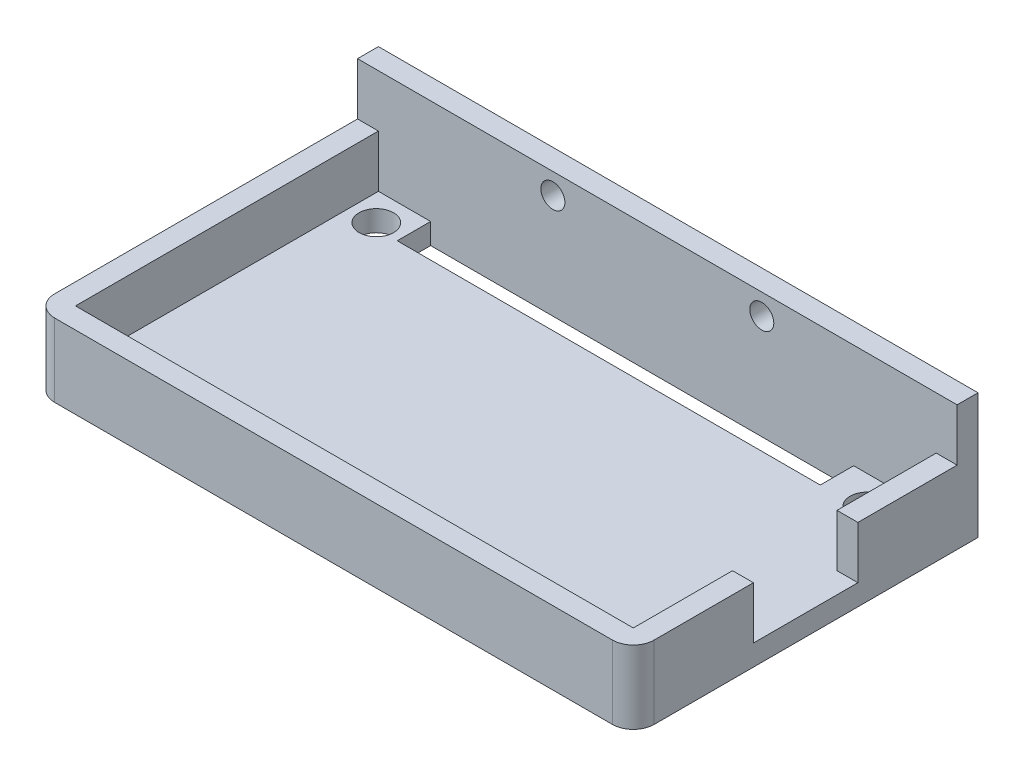
ISO-10303-21;
HEADER;
FILE_DESCRIPTION(('STEP AP214'),'2;1');
FILE_NAME('part.step','',(''),(''),'','','');
FILE_SCHEMA(('AUTOMOTIVE_DESIGN { 1 0 10303 214 1 1 1 1 }'));
ENDSEC;
DATA;
#1=APPLICATION_CONTEXT('core data for automotive mechanical design processes');
#2=APPLICATION_PROTOCOL_DEFINITION('international standard','automotive_design',2000,#1);
#3=PRODUCT_CONTEXT('',#1,'mechanical');
#4=PRODUCT('Part','Part','',(#3));
#5=PRODUCT_RELATED_PRODUCT_CATEGORY('part','',(#4));
#6=PRODUCT_DEFINITION_FORMATION('','',#4);
#7=PRODUCT_DEFINITION_CONTEXT('part definition',#1,'design');
#8=PRODUCT_DEFINITION('design','',#6,#7);
#9=PRODUCT_DEFINITION_SHAPE('','',#8);
#10=(LENGTH_UNIT() NAMED_UNIT(*) SI_UNIT(.MILLI.,.METRE.));
#11=(NAMED_UNIT(*) PLANE_ANGLE_UNIT() SI_UNIT($,.RADIAN.));
#12=(NAMED_UNIT(*) SI_UNIT($,.STERADIAN.) SOLID_ANGLE_UNIT());
#13=UNCERTAINTY_MEASURE_WITH_UNIT(LENGTH_MEASURE(1.E-05),#10,'distance_accuracy_value','');
#14=(GEOMETRIC_REPRESENTATION_CONTEXT(3) GLOBAL_UNCERTAINTY_ASSIGNED_CONTEXT((#13)) GLOBAL_UNIT_ASSIGNED_CONTEXT((#10,
#11,#12)) REPRESENTATION_CONTEXT('',''));
#15=CARTESIAN_POINT('',(0.,0.,0.));
#16=DIRECTION('',(0.,0.,1.));
#17=DIRECTION('',(1.,0.,0.));
#18=AXIS2_PLACEMENT_3D('',#15,#16,#17);
#19=CARTESIAN_POINT('',(0.,7.,0.));
#20=DIRECTION('',(0.,-1.,0.));
#21=DIRECTION('',(0.,0.,-1.));
#22=AXIS2_PLACEMENT_3D('',#19,#20,#21);
#23=PLANE('',#22);
#24=DIRECTION('',(0.,0.,1.));
#25=VECTOR('',#24,1.);
#26=CARTESIAN_POINT('',(0.,7.,0.));
#27=LINE('',#26,#25);
#28=CARTESIAN_POINT('',(0.,7.,-31.));
#29=VERTEX_POINT('',#28);
#30=CARTESIAN_POINT('',(0.,7.,-2.));
#31=VERTEX_POINT('',#30);
#32=EDGE_CURVE('E226',#29,#31,#27,.T.);
#33=ORIENTED_EDGE('',*,*,#32,.T.);
#34=CARTESIAN_POINT('',(2.,7.,-2.));
#35=DIRECTION('',(0.,-1.,0.));
#36=DIRECTION('',(0.,0.,-1.));
#37=AXIS2_PLACEMENT_3D('',#34,#35,#36);
#38=CIRCLE('',#37,2.);
#39=CARTESIAN_POINT('',(2.,7.,0.));
#40=VERTEX_POINT('',#39);
#41=EDGE_CURVE('E45',#31,#40,#38,.F.);
#42=ORIENTED_EDGE('',*,*,#41,.T.);
#43=DIRECTION('',(1.,0.,0.));
#44=VECTOR('',#43,1.);
#45=CARTESIAN_POINT('',(0.,7.,0.));
#46=LINE('',#45,#44);
#47=CARTESIAN_POINT('',(55.4,7.,0.));
#48=VERTEX_POINT('',#47);
#49=EDGE_CURVE('E373',#40,#48,#46,.T.);
#50=ORIENTED_EDGE('',*,*,#49,.T.);
#51=CARTESIAN_POINT('',(55.4,7.,-2.));
#52=DIRECTION('',(0.,-1.,0.));
#53=DIRECTION('',(0.,0.,-1.));
#54=AXIS2_PLACEMENT_3D('',#51,#52,#53);
#55=CIRCLE('',#54,2.);
#56=CARTESIAN_POINT('',(57.4,7.,-2.));
#57=VERTEX_POINT('',#56);
#58=EDGE_CURVE('E52',#48,#57,#55,.F.);
#59=ORIENTED_EDGE('',*,*,#58,.T.);
#60=DIRECTION('',(0.,0.,-1.));
#61=VECTOR('',#60,1.);
#62=CARTESIAN_POINT('',(57.4,7.,0.));
#63=LINE('',#62,#61);
#64=CARTESIAN_POINT('',(57.4,7.,-11.5));
#65=VERTEX_POINT('',#64);
#66=EDGE_CURVE('E377',#57,#65,#63,.T.);
#67=ORIENTED_EDGE('',*,*,#66,.T.);
#68=DIRECTION('',(1.,0.,0.));
#69=VECTOR('',#68,1.);
#70=CARTESIAN_POINT('',(55.4,7.,-11.5));
#71=LINE('',#70,#69);
#72=CARTESIAN_POINT('',(55.4,7.,-11.5));
#73=VERTEX_POINT('',#72);
#74=EDGE_CURVE('E227',#73,#65,#71,.T.);
#75=ORIENTED_EDGE('',*,*,#74,.F.);
#76=DIRECTION('',(0.,0.,-1.));
#77=VECTOR('',#76,1.);
#78=CARTESIAN_POINT('',(55.4,7.,0.));
#79=LINE('',#78,#77);
#80=CARTESIAN_POINT('',(55.4,7.,-2.));
#81=VERTEX_POINT('',#80);
#82=EDGE_CURVE('E349',#81,#73,#79,.T.);
#83=ORIENTED_EDGE('',*,*,#82,.F.);
#84=DIRECTION('',(1.,0.,0.));
#85=VECTOR('',#84,1.);
#86=CARTESIAN_POINT('',(0.,7.,-2.));
#87=LINE('',#86,#85);
#88=CARTESIAN_POINT('',(2.,7.,-2.));
#89=VERTEX_POINT('',#88);
#90=EDGE_CURVE('E367',#89,#81,#87,.T.);
#91=ORIENTED_EDGE('',*,*,#90,.F.);
#92=DIRECTION('',(0.,0.,1.));
#93=VECTOR('',#92,1.);
#94=CARTESIAN_POINT('',(2.,7.,0.));
#95=LINE('',#94,#93);
#96=CARTESIAN_POINT('',(2.,7.,-31.));
#97=VERTEX_POINT('',#96);
#98=EDGE_CURVE('E365',#97,#89,#95,.T.);
#99=ORIENTED_EDGE('',*,*,#98,.F.);
#100=DIRECTION('',(1.,0.,0.));
#101=VECTOR('',#100,1.);
#102=CARTESIAN_POINT('',(0.,7.,-31.));
#103=LINE('',#102,#101);
#104=EDGE_CURVE('E223',#29,#97,#103,.T.);
#105=ORIENTED_EDGE('',*,*,#104,.F.);
#106=EDGE_LOOP('',(#33,#42,#50,#59,#67,#75,#83,#91,#99,#105));
#107=FACE_BOUND('',#106,.T.);
#108=ADVANCED_FACE('F37',(#107),#23,.F.);
#109=CARTESIAN_POINT('',(55.4,7.,-31.));
#110=VERTEX_POINT('',#109);
#111=CARTESIAN_POINT('',(57.4,7.,-31.));
#112=VERTEX_POINT('',#111);
#113=EDGE_CURVE('E391',#110,#112,#103,.T.);
#114=ORIENTED_EDGE('',*,*,#113,.F.);
#115=CARTESIAN_POINT('',(55.4,7.,-21.5));
#116=VERTEX_POINT('',#115);
#117=EDGE_CURVE('E369',#116,#110,#79,.T.);
#118=ORIENTED_EDGE('',*,*,#117,.F.);
#119=DIRECTION('',(-1.,0.,0.));
#120=VECTOR('',#119,1.);
#121=CARTESIAN_POINT('',(55.4,7.,-21.5));
#122=LINE('',#121,#120);
#123=CARTESIAN_POINT('',(57.4,7.,-21.5));
#124=VERTEX_POINT('',#123);
#125=EDGE_CURVE('E230',#124,#116,#122,.T.);
#126=ORIENTED_EDGE('',*,*,#125,.F.);
#127=EDGE_CURVE('E376',#124,#112,#63,.T.);
#128=ORIENTED_EDGE('',*,*,#127,.T.);
#129=EDGE_LOOP('',(#114,#118,#126,#128));
#130=FACE_BOUND('',#129,.T.);
#131=ADVANCED_FACE('F428',(#130),#23,.F.);
#132=CARTESIAN_POINT('',(55.4,7.,0.));
#133=DIRECTION('',(-1.,0.,0.));
#134=DIRECTION('',(0.,0.,1.));
#135=AXIS2_PLACEMENT_3D('',#132,#133,#134);
#136=PLANE('',#135);
#137=DIRECTION('',(0.,1.,0.));
#138=VECTOR('',#137,1.);
#139=CARTESIAN_POINT('',(55.4,-8.19803902718557,-11.5));
#140=LINE('',#139,#138);
#141=CARTESIAN_POINT('',(55.4,2.,-11.5));
#142=VERTEX_POINT('',#141);
#143=EDGE_CURVE('E249',#142,#73,#140,.T.);
#144=ORIENTED_EDGE('',*,*,#143,.F.);
#145=DIRECTION('',(0.,0.,-1.));
#146=VECTOR('',#145,1.);
#147=CARTESIAN_POINT('',(55.4,2.,0.));
#148=LINE('',#147,#146);
#149=CARTESIAN_POINT('',(55.4,2.,-2.));
#150=VERTEX_POINT('',#149);
#151=EDGE_CURVE('E356',#150,#142,#148,.T.);
#152=ORIENTED_EDGE('',*,*,#151,.F.);
#153=DIRECTION('',(0.,-1.,0.));
#154=VECTOR('',#153,1.);
#155=CARTESIAN_POINT('',(55.4,7.,-2.));
#156=LINE('',#155,#154);
#157=EDGE_CURVE('E344',#81,#150,#156,.T.);
#158=ORIENTED_EDGE('',*,*,#157,.F.);
#159=ORIENTED_EDGE('',*,*,#82,.T.);
#160=EDGE_LOOP('',(#144,#152,#158,#159));
#161=FACE_BOUND('',#160,.T.);
#162=ADVANCED_FACE('F435',(#161),#136,.T.);
#163=CARTESIAN_POINT('',(0.,7.,0.));
#164=DIRECTION('',(1.,0.,0.));
#165=DIRECTION('',(0.,0.,-1.));
#166=AXIS2_PLACEMENT_3D('',#163,#164,#165);
#167=PLANE('',#166);
#168=DIRECTION('',(0.,0.,1.));
#169=VECTOR('',#168,1.);
#170=CARTESIAN_POINT('',(0.,0.,0.));
#171=LINE('',#170,#169);
#172=CARTESIAN_POINT('',(0.,0.,-33.));
#173=VERTEX_POINT('',#172);
#174=CARTESIAN_POINT('',(0.,0.,-2.));
#175=VERTEX_POINT('',#174);
#176=EDGE_CURVE('E343',#173,#175,#171,.T.);
#177=ORIENTED_EDGE('',*,*,#176,.T.);
#178=DIRECTION('',(0.,-1.,0.));
#179=VECTOR('',#178,1.);
#180=CARTESIAN_POINT('',(0.,7.,-2.));
#181=LINE('',#180,#179);
#182=EDGE_CURVE('E60',#175,#31,#181,.F.);
#183=ORIENTED_EDGE('',*,*,#182,.T.);
#184=ORIENTED_EDGE('',*,*,#32,.F.);
#185=DIRECTION('',(0.,-1.,0.));
#186=VECTOR('',#185,1.);
#187=CARTESIAN_POINT('',(0.,12.,-31.));
#188=LINE('',#187,#186);
#189=CARTESIAN_POINT('',(0.,12.,-31.));
#190=VERTEX_POINT('',#189);
#191=EDGE_CURVE('E207',#190,#29,#188,.T.);
#192=ORIENTED_EDGE('',*,*,#191,.F.);
#193=DIRECTION('',(0.,0.,1.));
#194=VECTOR('',#193,1.);
#195=CARTESIAN_POINT('',(0.,12.,-33.));
#196=LINE('',#195,#194);
#197=CARTESIAN_POINT('',(0.,12.,-33.));
#198=VERTEX_POINT('',#197);
#199=EDGE_CURVE('E215',#198,#190,#196,.T.);
#200=ORIENTED_EDGE('',*,*,#199,.F.);
#201=DIRECTION('',(0.,-1.,0.));
#202=VECTOR('',#201,1.);
#203=CARTESIAN_POINT('',(0.,7.,-33.));
#204=LINE('',#203,#202);
#205=EDGE_CURVE('E379',#198,#173,#204,.T.);
#206=ORIENTED_EDGE('',*,*,#205,.T.);
#207=EDGE_LOOP('',(#177,#183,#184,#192,#200,#206));
#208=FACE_BOUND('',#207,.T.);
#209=ADVANCED_FACE('F225',(#208),#167,.F.);
#210=CARTESIAN_POINT('',(0.,7.,0.));
#211=DIRECTION('',(0.,0.,-1.));
#212=DIRECTION('',(-1.,0.,0.));
#213=AXIS2_PLACEMENT_3D('',#210,#211,#212);
#214=PLANE('',#213);
#215=ORIENTED_EDGE('',*,*,#49,.F.);
#216=DIRECTION('',(0.,-1.,0.));
#217=VECTOR('',#216,1.);
#218=CARTESIAN_POINT('',(2.,7.,0.));
#219=LINE('',#218,#217);
#220=CARTESIAN_POINT('',(2.,0.,0.));
#221=VERTEX_POINT('',#220);
#222=EDGE_CURVE('E394',#40,#221,#219,.T.);
#223=ORIENTED_EDGE('',*,*,#222,.T.);
#224=DIRECTION('',(1.,0.,0.));
#225=VECTOR('',#224,1.);
#226=CARTESIAN_POINT('',(0.,0.,0.));
#227=LINE('',#226,#225);
#228=CARTESIAN_POINT('',(55.4,0.,0.));
#229=VERTEX_POINT('',#228);
#230=EDGE_CURVE('E381',#221,#229,#227,.T.);
#231=ORIENTED_EDGE('',*,*,#230,.T.);
#232=DIRECTION('',(0.,-1.,0.));
#233=VECTOR('',#232,1.);
#234=CARTESIAN_POINT('',(55.4,7.,0.));
#235=LINE('',#234,#233);
#236=EDGE_CURVE('E392',#229,#48,#235,.F.);
#237=ORIENTED_EDGE('',*,*,#236,.T.);
#238=EDGE_LOOP('',(#215,#223,#231,#237));
#239=FACE_BOUND('',#238,.T.);
#240=ADVANCED_FACE('F407',(#239),#214,.F.);
#241=CARTESIAN_POINT('',(57.4,7.,0.));
#242=DIRECTION('',(-1.,0.,0.));
#243=DIRECTION('',(0.,0.,1.));
#244=AXIS2_PLACEMENT_3D('',#241,#242,#243);
#245=PLANE('',#244);
#246=ORIENTED_EDGE('',*,*,#66,.F.);
#247=DIRECTION('',(0.,-1.,0.));
#248=VECTOR('',#247,1.);
#249=CARTESIAN_POINT('',(57.4,7.,-2.));
#250=LINE('',#249,#248);
#251=CARTESIAN_POINT('',(57.4,0.,-2.));
#252=VERTEX_POINT('',#251);
#253=EDGE_CURVE('E11',#57,#252,#250,.T.);
#254=ORIENTED_EDGE('',*,*,#253,.T.);
#255=DIRECTION('',(0.,0.,-1.));
#256=VECTOR('',#255,1.);
#257=CARTESIAN_POINT('',(57.4,0.,0.));
#258=LINE('',#257,#256);
#259=CARTESIAN_POINT('',(57.4,0.,-33.));
#260=VERTEX_POINT('',#259);
#261=EDGE_CURVE('E384',#252,#260,#258,.T.);
#262=ORIENTED_EDGE('',*,*,#261,.T.);
#263=DIRECTION('',(0.,-1.,0.));
#264=VECTOR('',#263,1.);
#265=CARTESIAN_POINT('',(57.4,7.,-33.));
#266=LINE('',#265,#264);
#267=CARTESIAN_POINT('',(57.4,12.,-33.));
#268=VERTEX_POINT('',#267);
#269=EDGE_CURVE('E388',#268,#260,#266,.T.);
#270=ORIENTED_EDGE('',*,*,#269,.F.);
#271=DIRECTION('',(0.,0.,-1.));
#272=VECTOR('',#271,1.);
#273=CARTESIAN_POINT('',(57.4,12.,-33.));
#274=LINE('',#273,#272);
#275=CARTESIAN_POINT('',(57.4,12.,-31.));
#276=VERTEX_POINT('',#275);
#277=EDGE_CURVE('E214',#276,#268,#274,.T.);
#278=ORIENTED_EDGE('',*,*,#277,.F.);
#279=DIRECTION('',(0.,-1.,0.));
#280=VECTOR('',#279,1.);
#281=CARTESIAN_POINT('',(57.4,12.,-31.));
#282=LINE('',#281,#280);
#283=EDGE_CURVE('E210',#276,#112,#282,.T.);
#284=ORIENTED_EDGE('',*,*,#283,.T.);
#285=ORIENTED_EDGE('',*,*,#127,.F.);
#286=DIRECTION('',(0.,1.,0.));
#287=VECTOR('',#286,1.);
#288=CARTESIAN_POINT('',(57.4,-8.19803902718557,-21.5));
#289=LINE('',#288,#287);
#290=CARTESIAN_POINT('',(57.4,2.,-21.5));
#291=VERTEX_POINT('',#290);
#292=EDGE_CURVE('E243',#291,#124,#289,.T.);
#293=ORIENTED_EDGE('',*,*,#292,.F.);
#294=DIRECTION('',(0.,0.,-1.));
#295=VECTOR('',#294,1.);
#296=CARTESIAN_POINT('',(57.4,2.,-21.5));
#297=LINE('',#296,#295);
#298=CARTESIAN_POINT('',(57.4,2.,-11.5));
#299=VERTEX_POINT('',#298);
#300=EDGE_CURVE('E244',#299,#291,#297,.T.);
#301=ORIENTED_EDGE('',*,*,#300,.F.);
#302=DIRECTION('',(0.,1.,0.));
#303=VECTOR('',#302,1.);
#304=CARTESIAN_POINT('',(57.4,-8.19803902718557,-11.5));
#305=LINE('',#304,#303);
#306=EDGE_CURVE('E239',#299,#65,#305,.T.);
#307=ORIENTED_EDGE('',*,*,#306,.T.);
#308=EDGE_LOOP('',(#246,#254,#262,#270,#278,#284,#285,#293,#301,#307));
#309=FACE_BOUND('',#308,.T.);
#310=ADVANCED_FACE('F419',(#309),#245,.F.);
#311=CARTESIAN_POINT('',(0.,7.,-33.));
#312=DIRECTION('',(0.,0.,1.));
#313=DIRECTION('',(1.,0.,0.));
#314=AXIS2_PLACEMENT_3D('',#311,#312,#313);
#315=PLANE('',#314);
#316=CARTESIAN_POINT('',(38.7,10.,-33.));
#317=DIRECTION('',(0.,0.,-1.));
#318=DIRECTION('',(-1.,0.,0.));
#319=AXIS2_PLACEMENT_3D('',#316,#317,#318);
#320=CIRCLE('',#319,1.15);
#321=CARTESIAN_POINT('',(37.55,10.,-33.));
#322=VERTEX_POINT('',#321);
#323=EDGE_CURVE('E484',#322,#322,#320,.T.);
#324=ORIENTED_EDGE('',*,*,#323,.F.);
#325=EDGE_LOOP('',(#324));
#326=FACE_BOUND('',#325,.T.);
#327=CARTESIAN_POINT('',(18.7,10.,-33.));
#328=DIRECTION('',(0.,0.,-1.));
#329=DIRECTION('',(-1.,0.,0.));
#330=AXIS2_PLACEMENT_3D('',#327,#328,#329);
#331=CIRCLE('',#330,1.15);
#332=CARTESIAN_POINT('',(17.55,10.,-33.));
#333=VERTEX_POINT('',#332);
#334=EDGE_CURVE('E496',#333,#333,#331,.T.);
#335=ORIENTED_EDGE('',*,*,#334,.F.);
#336=EDGE_LOOP('',(#335));
#337=FACE_BOUND('',#336,.T.);
#338=DIRECTION('',(-1.,0.,0.));
#339=VECTOR('',#338,1.);
#340=CARTESIAN_POINT('',(0.,0.,-33.));
#341=LINE('',#340,#339);
#342=EDGE_CURVE('E374',#260,#173,#341,.T.);
#343=ORIENTED_EDGE('',*,*,#342,.T.);
#344=ORIENTED_EDGE('',*,*,#205,.F.);
#345=DIRECTION('',(-1.,0.,0.));
#346=VECTOR('',#345,1.);
#347=CARTESIAN_POINT('',(0.,12.,-33.));
#348=LINE('',#347,#346);
#349=EDGE_CURVE('E221',#268,#198,#348,.T.);
#350=ORIENTED_EDGE('',*,*,#349,.F.);
#351=ORIENTED_EDGE('',*,*,#269,.T.);
#352=EDGE_LOOP('',(#343,#344,#350,#351));
#353=FACE_BOUND('',#352,.T.);
#354=ADVANCED_FACE('F416',(#326,#337,#353),#315,.F.);
#355=CARTESIAN_POINT('',(0.,0.,0.));
#356=DIRECTION('',(0.,-1.,0.));
#357=DIRECTION('',(0.,0.,-1.));
#358=AXIS2_PLACEMENT_3D('',#355,#356,#357);
#359=PLANE('',#358);
#360=DIRECTION('',(0.,0.,1.));
#361=VECTOR('',#360,1.);
#362=CARTESIAN_POINT('',(7.,0.,-31.));
#363=LINE('',#362,#361);
#364=CARTESIAN_POINT('',(7.,0.,-31.));
#365=VERTEX_POINT('',#364);
#366=CARTESIAN_POINT('',(7.,0.,-27.8));
#367=VERTEX_POINT('',#366);
#368=EDGE_CURVE('E255',#365,#367,#363,.T.);
#369=ORIENTED_EDGE('',*,*,#368,.T.);
#370=DIRECTION('',(1.,0.,0.));
#371=VECTOR('',#370,1.);
#372=CARTESIAN_POINT('',(7.,0.,-27.8));
#373=LINE('',#372,#371);
#374=CARTESIAN_POINT('',(47.5,0.,-27.8));
#375=VERTEX_POINT('',#374);
#376=EDGE_CURVE('E258',#367,#375,#373,.T.);
#377=ORIENTED_EDGE('',*,*,#376,.T.);
#378=DIRECTION('',(0.,0.,-1.));
#379=VECTOR('',#378,1.);
#380=CARTESIAN_POINT('',(47.5,0.,-31.));
#381=LINE('',#380,#379);
#382=CARTESIAN_POINT('',(47.5,0.,-31.));
#383=VERTEX_POINT('',#382);
#384=EDGE_CURVE('E262',#375,#383,#381,.T.);
#385=ORIENTED_EDGE('',*,*,#384,.T.);
#386=DIRECTION('',(-1.,0.,0.));
#387=VECTOR('',#386,1.);
#388=CARTESIAN_POINT('',(7.,0.,-31.));
#389=LINE('',#388,#387);
#390=EDGE_CURVE('E265',#383,#365,#389,.T.);
#391=ORIENTED_EDGE('',*,*,#390,.T.);
#392=EDGE_LOOP('',(#369,#377,#385,#391));
#393=FACE_BOUND('',#392,.T.);
#394=DIRECTION('',(1.,0.,0.));
#395=VECTOR('',#394,1.);
#396=CARTESIAN_POINT('',(7.,0.,-2.));
#397=LINE('',#396,#395);
#398=CARTESIAN_POINT('',(7.,0.,-2.));
#399=VERTEX_POINT('',#398);
#400=CARTESIAN_POINT('',(47.5,0.,-2.));
#401=VERTEX_POINT('',#400);
#402=EDGE_CURVE('E298',#399,#401,#397,.T.);
#403=ORIENTED_EDGE('',*,*,#402,.T.);
#404=DIRECTION('',(0.,0.,-1.));
#405=VECTOR('',#404,1.);
#406=CARTESIAN_POINT('',(47.5,0.,-2.));
#407=LINE('',#406,#405);
#408=CARTESIAN_POINT('',(47.5,0.,-5.2));
#409=VERTEX_POINT('',#408);
#410=EDGE_CURVE('E308',#401,#409,#407,.T.);
#411=ORIENTED_EDGE('',*,*,#410,.T.);
#412=DIRECTION('',(-1.,0.,0.));
#413=VECTOR('',#412,1.);
#414=CARTESIAN_POINT('',(7.,0.,-5.2));
#415=LINE('',#414,#413);
#416=CARTESIAN_POINT('',(7.,0.,-5.2));
#417=VERTEX_POINT('',#416);
#418=EDGE_CURVE('E305',#409,#417,#415,.T.);
#419=ORIENTED_EDGE('',*,*,#418,.T.);
#420=DIRECTION('',(0.,0.,1.));
#421=VECTOR('',#420,1.);
#422=CARTESIAN_POINT('',(7.,0.,-2.));
#423=LINE('',#422,#421);
#424=EDGE_CURVE('E288',#417,#399,#423,.T.);
#425=ORIENTED_EDGE('',*,*,#424,.T.);
#426=EDGE_LOOP('',(#403,#411,#419,#425));
#427=FACE_BOUND('',#426,.T.);
#428=CARTESIAN_POINT('',(51.5,0.,-28.3));
#429=DIRECTION('',(0.,1.,0.));
#430=DIRECTION('',(0.,0.,1.));
#431=AXIS2_PLACEMENT_3D('',#428,#429,#430);
#432=CIRCLE('',#431,1.65);
#433=CARTESIAN_POINT('',(51.5,0.,-26.65));
#434=VERTEX_POINT('',#433);
#435=EDGE_CURVE('E323',#434,#434,#432,.T.);
#436=ORIENTED_EDGE('',*,*,#435,.T.);
#437=EDGE_LOOP('',(#436));
#438=FACE_BOUND('',#437,.T.);
#439=CARTESIAN_POINT('',(4.5,0.,-4.7));
#440=DIRECTION('',(0.,1.,0.));
#441=DIRECTION('',(0.,0.,1.));
#442=AXIS2_PLACEMENT_3D('',#439,#440,#441);
#443=CIRCLE('',#442,1.65);
#444=CARTESIAN_POINT('',(4.5,0.,-3.05));
#445=VERTEX_POINT('',#444);
#446=EDGE_CURVE('E316',#445,#445,#443,.T.);
#447=ORIENTED_EDGE('',*,*,#446,.T.);
#448=EDGE_LOOP('',(#447));
#449=FACE_BOUND('',#448,.T.);
#450=CARTESIAN_POINT('',(51.5,0.,-4.7));
#451=DIRECTION('',(0.,1.,0.));
#452=DIRECTION('',(0.,0.,1.));
#453=AXIS2_PLACEMENT_3D('',#450,#451,#452);
#454=CIRCLE('',#453,1.65);
#455=CARTESIAN_POINT('',(51.5,0.,-3.05));
#456=VERTEX_POINT('',#455);
#457=EDGE_CURVE('E279',#456,#456,#454,.T.);
#458=ORIENTED_EDGE('',*,*,#457,.T.);
#459=EDGE_LOOP('',(#458));
#460=FACE_BOUND('',#459,.T.);
#461=CARTESIAN_POINT('',(4.5,0.,-28.3));
#462=DIRECTION('',(0.,1.,0.));
#463=DIRECTION('',(0.,0.,1.));
#464=AXIS2_PLACEMENT_3D('',#461,#462,#463);
#465=CIRCLE('',#464,1.65);
#466=CARTESIAN_POINT('',(4.5,0.,-26.65));
#467=VERTEX_POINT('',#466);
#468=EDGE_CURVE('E331',#467,#467,#465,.T.);
#469=ORIENTED_EDGE('',*,*,#468,.T.);
#470=EDGE_LOOP('',(#469));
#471=FACE_BOUND('',#470,.T.);
#472=ORIENTED_EDGE('',*,*,#230,.F.);
#473=CARTESIAN_POINT('',(2.,0.,-2.));
#474=DIRECTION('',(0.,-1.,0.));
#475=DIRECTION('',(0.,0.,-1.));
#476=AXIS2_PLACEMENT_3D('',#473,#474,#475);
#477=CIRCLE('',#476,2.);
#478=EDGE_CURVE('E399',#221,#175,#477,.T.);
#479=ORIENTED_EDGE('',*,*,#478,.T.);
#480=ORIENTED_EDGE('',*,*,#176,.F.);
#481=ORIENTED_EDGE('',*,*,#342,.F.);
#482=ORIENTED_EDGE('',*,*,#261,.F.);
#483=CARTESIAN_POINT('',(55.4,0.,-2.));
#484=DIRECTION('',(0.,-1.,0.));
#485=DIRECTION('',(0.,0.,-1.));
#486=AXIS2_PLACEMENT_3D('',#483,#484,#485);
#487=CIRCLE('',#486,2.);
#488=EDGE_CURVE('E397',#252,#229,#487,.T.);
#489=ORIENTED_EDGE('',*,*,#488,.T.);
#490=EDGE_LOOP('',(#472,#479,#480,#481,#482,#489));
#491=FACE_BOUND('',#490,.T.);
#492=ADVANCED_FACE('F413',(#393,#427,#438,#449,#460,#471,#491),#359,.T.);
#493=CARTESIAN_POINT('',(2.,7.,0.));
#494=DIRECTION('',(1.,0.,0.));
#495=DIRECTION('',(0.,0.,-1.));
#496=AXIS2_PLACEMENT_3D('',#493,#494,#495);
#497=PLANE('',#496);
#498=DIRECTION('',(0.,0.,1.));
#499=VECTOR('',#498,1.);
#500=CARTESIAN_POINT('',(2.,2.,0.));
#501=LINE('',#500,#499);
#502=CARTESIAN_POINT('',(2.,2.,-31.));
#503=VERTEX_POINT('',#502);
#504=CARTESIAN_POINT('',(2.,2.,-2.));
#505=VERTEX_POINT('',#504);
#506=EDGE_CURVE('E334',#503,#505,#501,.T.);
#507=ORIENTED_EDGE('',*,*,#506,.F.);
#508=DIRECTION('',(0.,-1.,0.));
#509=VECTOR('',#508,1.);
#510=CARTESIAN_POINT('',(2.,7.,-31.));
#511=LINE('',#510,#509);
#512=EDGE_CURVE('E345',#97,#503,#511,.T.);
#513=ORIENTED_EDGE('',*,*,#512,.F.);
#514=ORIENTED_EDGE('',*,*,#98,.T.);
#515=DIRECTION('',(0.,-1.,0.));
#516=VECTOR('',#515,1.);
#517=CARTESIAN_POINT('',(2.,7.,-2.));
#518=LINE('',#517,#516);
#519=EDGE_CURVE('E340',#89,#505,#518,.T.);
#520=ORIENTED_EDGE('',*,*,#519,.T.);
#521=EDGE_LOOP('',(#507,#513,#514,#520));
#522=FACE_BOUND('',#521,.T.);
#523=ADVANCED_FACE('F443',(#522),#497,.T.);
#524=CARTESIAN_POINT('',(0.,7.,-2.));
#525=DIRECTION('',(0.,0.,-1.));
#526=DIRECTION('',(-1.,0.,0.));
#527=AXIS2_PLACEMENT_3D('',#524,#525,#526);
#528=PLANE('',#527);
#529=DIRECTION('',(1.,0.,0.));
#530=VECTOR('',#529,1.);
#531=CARTESIAN_POINT('',(0.,2.,-2.));
#532=LINE('',#531,#530);
#533=CARTESIAN_POINT('',(7.,2.,-2.));
#534=VERTEX_POINT('',#533);
#535=EDGE_CURVE('E350',#505,#534,#532,.T.);
#536=ORIENTED_EDGE('',*,*,#535,.F.);
#537=ORIENTED_EDGE('',*,*,#519,.F.);
#538=ORIENTED_EDGE('',*,*,#90,.T.);
#539=ORIENTED_EDGE('',*,*,#157,.T.);
#540=CARTESIAN_POINT('',(47.5,2.,-2.));
#541=VERTEX_POINT('',#540);
#542=EDGE_CURVE('E339',#541,#150,#532,.T.);
#543=ORIENTED_EDGE('',*,*,#542,.F.);
#544=DIRECTION('',(0.,1.,0.));
#545=VECTOR('',#544,1.);
#546=CARTESIAN_POINT('',(47.5,0.,-2.));
#547=LINE('',#546,#545);
#548=EDGE_CURVE('E286',#401,#541,#547,.T.);
#549=ORIENTED_EDGE('',*,*,#548,.F.);
#550=ORIENTED_EDGE('',*,*,#402,.F.);
#551=DIRECTION('',(0.,1.,0.));
#552=VECTOR('',#551,1.);
#553=CARTESIAN_POINT('',(7.,0.,-2.));
#554=LINE('',#553,#552);
#555=EDGE_CURVE('E254',#399,#534,#554,.T.);
#556=ORIENTED_EDGE('',*,*,#555,.T.);
#557=EDGE_LOOP('',(#536,#537,#538,#539,#543,#549,#550,#556));
#558=FACE_BOUND('',#557,.T.);
#559=ADVANCED_FACE('F465',(#558),#528,.T.);
#560=DIRECTION('',(0.,1.,0.));
#561=VECTOR('',#560,1.);
#562=CARTESIAN_POINT('',(55.4,-8.19803902718557,-21.5));
#563=LINE('',#562,#561);
#564=CARTESIAN_POINT('',(55.4,2.,-21.5));
#565=VERTEX_POINT('',#564);
#566=EDGE_CURVE('E242',#565,#116,#563,.T.);
#567=ORIENTED_EDGE('',*,*,#566,.T.);
#568=ORIENTED_EDGE('',*,*,#117,.T.);
#569=DIRECTION('',(0.,-1.,0.));
#570=VECTOR('',#569,1.);
#571=CARTESIAN_POINT('',(55.4,7.,-31.));
#572=LINE('',#571,#570);
#573=CARTESIAN_POINT('',(55.4,2.,-31.));
#574=VERTEX_POINT('',#573);
#575=EDGE_CURVE('E348',#110,#574,#572,.T.);
#576=ORIENTED_EDGE('',*,*,#575,.T.);
#577=EDGE_CURVE('E353',#565,#574,#148,.T.);
#578=ORIENTED_EDGE('',*,*,#577,.F.);
#579=EDGE_LOOP('',(#567,#568,#576,#578));
#580=FACE_BOUND('',#579,.T.);
#581=ADVANCED_FACE('F458',(#580),#136,.T.);
#582=CARTESIAN_POINT('',(0.,7.,-31.));
#583=DIRECTION('',(0.,0.,1.));
#584=DIRECTION('',(1.,0.,0.));
#585=AXIS2_PLACEMENT_3D('',#582,#583,#584);
#586=PLANE('',#585);
#587=CARTESIAN_POINT('',(38.7,10.,-31.));
#588=DIRECTION('',(0.,0.,1.));
#589=DIRECTION('',(1.,0.,0.));
#590=AXIS2_PLACEMENT_3D('',#587,#588,#589);
#591=CIRCLE('',#590,1.15);
#592=CARTESIAN_POINT('',(39.85,10.,-31.));
#593=VERTEX_POINT('',#592);
#594=EDGE_CURVE('E486',#593,#593,#591,.F.);
#595=ORIENTED_EDGE('',*,*,#594,.T.);
#596=EDGE_LOOP('',(#595));
#597=FACE_BOUND('',#596,.T.);
#598=CARTESIAN_POINT('',(18.7,10.,-31.));
#599=DIRECTION('',(0.,0.,1.));
#600=DIRECTION('',(1.,0.,0.));
#601=AXIS2_PLACEMENT_3D('',#598,#599,#600);
#602=CIRCLE('',#601,1.15);
#603=CARTESIAN_POINT('',(19.85,10.,-31.));
#604=VERTEX_POINT('',#603);
#605=EDGE_CURVE('E491',#604,#604,#602,.F.);
#606=ORIENTED_EDGE('',*,*,#605,.T.);
#607=EDGE_LOOP('',(#606));
#608=FACE_BOUND('',#607,.T.);
#609=DIRECTION('',(-1.,0.,0.));
#610=VECTOR('',#609,1.);
#611=CARTESIAN_POINT('',(0.,2.,-31.));
#612=LINE('',#611,#610);
#613=CARTESIAN_POINT('',(47.5,2.,-31.));
#614=VERTEX_POINT('',#613);
#615=EDGE_CURVE('E362',#574,#614,#612,.T.);
#616=ORIENTED_EDGE('',*,*,#615,.F.);
#617=ORIENTED_EDGE('',*,*,#575,.F.);
#618=ORIENTED_EDGE('',*,*,#113,.T.);
#619=ORIENTED_EDGE('',*,*,#283,.F.);
#620=DIRECTION('',(1.,0.,0.));
#621=VECTOR('',#620,1.);
#622=CARTESIAN_POINT('',(0.,12.,-31.));
#623=LINE('',#622,#621);
#624=EDGE_CURVE('E201',#190,#276,#623,.T.);
#625=ORIENTED_EDGE('',*,*,#624,.F.);
#626=ORIENTED_EDGE('',*,*,#191,.T.);
#627=ORIENTED_EDGE('',*,*,#104,.T.);
#628=ORIENTED_EDGE('',*,*,#512,.T.);
#629=CARTESIAN_POINT('',(7.,2.,-31.));
#630=VERTEX_POINT('',#629);
#631=EDGE_CURVE('E359',#630,#503,#612,.T.);
#632=ORIENTED_EDGE('',*,*,#631,.F.);
#633=DIRECTION('',(0.,1.,0.));
#634=VECTOR('',#633,1.);
#635=CARTESIAN_POINT('',(7.,0.,-31.));
#636=LINE('',#635,#634);
#637=EDGE_CURVE('E277',#365,#630,#636,.T.);
#638=ORIENTED_EDGE('',*,*,#637,.F.);
#639=ORIENTED_EDGE('',*,*,#390,.F.);
#640=DIRECTION('',(0.,1.,0.));
#641=VECTOR('',#640,1.);
#642=CARTESIAN_POINT('',(47.5,0.,-31.));
#643=LINE('',#642,#641);
#644=EDGE_CURVE('E280',#383,#614,#643,.T.);
#645=ORIENTED_EDGE('',*,*,#644,.T.);
#646=EDGE_LOOP('',(#616,#617,#618,#619,#625,#626,#627,#628,#632,#638,#639,#645));
#647=FACE_BOUND('',#646,.T.);
#648=ADVANCED_FACE('F204',(#597,#608,#647),#586,.T.);
#649=CARTESIAN_POINT('',(0.,2.,0.));
#650=DIRECTION('',(0.,-1.,0.));
#651=DIRECTION('',(0.,0.,-1.));
#652=AXIS2_PLACEMENT_3D('',#649,#650,#651);
#653=PLANE('',#652);
#654=CARTESIAN_POINT('',(51.5,2.,-28.3));
#655=DIRECTION('',(0.,1.,0.));
#656=DIRECTION('',(0.,0.,1.));
#657=AXIS2_PLACEMENT_3D('',#654,#655,#656);
#658=CIRCLE('',#657,1.65);
#659=CARTESIAN_POINT('',(51.5,2.,-26.65));
#660=VERTEX_POINT('',#659);
#661=EDGE_CURVE('E319',#660,#660,#658,.T.);
#662=ORIENTED_EDGE('',*,*,#661,.F.);
#663=EDGE_LOOP('',(#662));
#664=FACE_BOUND('',#663,.T.);
#665=CARTESIAN_POINT('',(4.5,2.,-4.7));
#666=DIRECTION('',(0.,1.,0.));
#667=DIRECTION('',(0.,0.,1.));
#668=AXIS2_PLACEMENT_3D('',#665,#666,#667);
#669=CIRCLE('',#668,1.65);
#670=CARTESIAN_POINT('',(4.5,2.,-3.05));
#671=VERTEX_POINT('',#670);
#672=EDGE_CURVE('E326',#671,#671,#669,.T.);
#673=ORIENTED_EDGE('',*,*,#672,.F.);
#674=EDGE_LOOP('',(#673));
#675=FACE_BOUND('',#674,.T.);
#676=CARTESIAN_POINT('',(51.5,2.,-4.7));
#677=DIRECTION('',(0.,1.,0.));
#678=DIRECTION('',(0.,0.,1.));
#679=AXIS2_PLACEMENT_3D('',#676,#677,#678);
#680=CIRCLE('',#679,1.65);
#681=CARTESIAN_POINT('',(51.5,2.,-3.05));
#682=VERTEX_POINT('',#681);
#683=EDGE_CURVE('E313',#682,#682,#680,.T.);
#684=ORIENTED_EDGE('',*,*,#683,.F.);
#685=EDGE_LOOP('',(#684));
#686=FACE_BOUND('',#685,.T.);
#687=CARTESIAN_POINT('',(4.5,2.,-28.3));
#688=DIRECTION('',(0.,1.,0.));
#689=DIRECTION('',(0.,0.,1.));
#690=AXIS2_PLACEMENT_3D('',#687,#688,#689);
#691=CIRCLE('',#690,1.65);
#692=CARTESIAN_POINT('',(4.5,2.,-26.65));
#693=VERTEX_POINT('',#692);
#694=EDGE_CURVE('E322',#693,#693,#691,.T.);
#695=ORIENTED_EDGE('',*,*,#694,.F.);
#696=EDGE_LOOP('',(#695));
#697=FACE_BOUND('',#696,.T.);
#698=DIRECTION('',(1.,0.,0.));
#699=VECTOR('',#698,1.);
#700=CARTESIAN_POINT('',(7.,2.,-27.8));
#701=LINE('',#700,#699);
#702=CARTESIAN_POINT('',(7.,2.,-27.8));
#703=VERTEX_POINT('',#702);
#704=CARTESIAN_POINT('',(47.5,2.,-27.8));
#705=VERTEX_POINT('',#704);
#706=EDGE_CURVE('E271',#703,#705,#701,.T.);
#707=ORIENTED_EDGE('',*,*,#706,.F.);
#708=DIRECTION('',(0.,0.,1.));
#709=VECTOR('',#708,1.);
#710=CARTESIAN_POINT('',(7.,2.,-31.));
#711=LINE('',#710,#709);
#712=EDGE_CURVE('E269',#630,#703,#711,.T.);
#713=ORIENTED_EDGE('',*,*,#712,.F.);
#714=ORIENTED_EDGE('',*,*,#631,.T.);
#715=ORIENTED_EDGE('',*,*,#506,.T.);
#716=ORIENTED_EDGE('',*,*,#535,.T.);
#717=DIRECTION('',(0.,0.,1.));
#718=VECTOR('',#717,1.);
#719=CARTESIAN_POINT('',(7.,2.,-2.));
#720=LINE('',#719,#718);
#721=CARTESIAN_POINT('',(7.,2.,-5.2));
#722=VERTEX_POINT('',#721);
#723=EDGE_CURVE('E294',#722,#534,#720,.T.);
#724=ORIENTED_EDGE('',*,*,#723,.F.);
#725=DIRECTION('',(-1.,0.,0.));
#726=VECTOR('',#725,1.);
#727=CARTESIAN_POINT('',(7.,2.,-5.2));
#728=LINE('',#727,#726);
#729=CARTESIAN_POINT('',(47.5,2.,-5.2));
#730=VERTEX_POINT('',#729);
#731=EDGE_CURVE('E297',#730,#722,#728,.T.);
#732=ORIENTED_EDGE('',*,*,#731,.F.);
#733=DIRECTION('',(0.,0.,-1.));
#734=VECTOR('',#733,1.);
#735=CARTESIAN_POINT('',(47.5,2.,-2.));
#736=LINE('',#735,#734);
#737=EDGE_CURVE('E272',#541,#730,#736,.T.);
#738=ORIENTED_EDGE('',*,*,#737,.F.);
#739=ORIENTED_EDGE('',*,*,#542,.T.);
#740=ORIENTED_EDGE('',*,*,#151,.T.);
#741=DIRECTION('',(1.,0.,0.));
#742=VECTOR('',#741,1.);
#743=CARTESIAN_POINT('',(55.4,2.,-11.5));
#744=LINE('',#743,#742);
#745=EDGE_CURVE('E235',#142,#299,#744,.T.);
#746=ORIENTED_EDGE('',*,*,#745,.T.);
#747=ORIENTED_EDGE('',*,*,#300,.T.);
#748=DIRECTION('',(-1.,0.,0.));
#749=VECTOR('',#748,1.);
#750=CARTESIAN_POINT('',(55.4,2.,-21.5));
#751=LINE('',#750,#749);
#752=EDGE_CURVE('E240',#291,#565,#751,.T.);
#753=ORIENTED_EDGE('',*,*,#752,.T.);
#754=ORIENTED_EDGE('',*,*,#577,.T.);
#755=ORIENTED_EDGE('',*,*,#615,.T.);
#756=DIRECTION('',(0.,0.,-1.));
#757=VECTOR('',#756,1.);
#758=CARTESIAN_POINT('',(47.5,2.,-31.));
#759=LINE('',#758,#757);
#760=EDGE_CURVE('E259',#705,#614,#759,.T.);
#761=ORIENTED_EDGE('',*,*,#760,.F.);
#762=EDGE_LOOP('',(#707,#713,#714,#715,#716,#724,#732,#738,#739,#740,#746,#747,#753,#754,#755,#761));
#763=FACE_BOUND('',#762,.T.);
#764=ADVANCED_FACE('F439',(#664,#675,#686,#697,#763),#653,.F.);
#765=CARTESIAN_POINT('',(4.5,0.,-28.3));
#766=DIRECTION('',(0.,1.,0.));
#767=DIRECTION('',(0.,0.,1.));
#768=AXIS2_PLACEMENT_3D('',#765,#766,#767);
#769=CYLINDRICAL_SURFACE('',#768,1.65);
#770=ORIENTED_EDGE('',*,*,#468,.F.);
#771=EDGE_LOOP('',(#770));
#772=FACE_BOUND('',#771,.T.);
#773=ORIENTED_EDGE('',*,*,#694,.T.);
#774=EDGE_LOOP('',(#773));
#775=FACE_BOUND('',#774,.T.);
#776=ADVANCED_FACE('F559',(#772,#775),#769,.F.);
#777=CARTESIAN_POINT('',(51.5,0.,-4.7));
#778=DIRECTION('',(0.,1.,0.));
#779=DIRECTION('',(0.,0.,1.));
#780=AXIS2_PLACEMENT_3D('',#777,#778,#779);
#781=CYLINDRICAL_SURFACE('',#780,1.65);
#782=ORIENTED_EDGE('',*,*,#457,.F.);
#783=EDGE_LOOP('',(#782));
#784=FACE_BOUND('',#783,.T.);
#785=ORIENTED_EDGE('',*,*,#683,.T.);
#786=EDGE_LOOP('',(#785));
#787=FACE_BOUND('',#786,.T.);
#788=ADVANCED_FACE('F555',(#784,#787),#781,.F.);
#789=CARTESIAN_POINT('',(4.5,0.,-4.7));
#790=DIRECTION('',(0.,1.,0.));
#791=DIRECTION('',(0.,0.,1.));
#792=AXIS2_PLACEMENT_3D('',#789,#790,#791);
#793=CYLINDRICAL_SURFACE('',#792,1.65);
#794=ORIENTED_EDGE('',*,*,#446,.F.);
#795=EDGE_LOOP('',(#794));
#796=FACE_BOUND('',#795,.T.);
#797=ORIENTED_EDGE('',*,*,#672,.T.);
#798=EDGE_LOOP('',(#797));
#799=FACE_BOUND('',#798,.T.);
#800=ADVANCED_FACE('F558',(#796,#799),#793,.F.);
#801=CARTESIAN_POINT('',(51.5,0.,-28.3));
#802=DIRECTION('',(0.,1.,0.));
#803=DIRECTION('',(0.,0.,1.));
#804=AXIS2_PLACEMENT_3D('',#801,#802,#803);
#805=CYLINDRICAL_SURFACE('',#804,1.65);
#806=ORIENTED_EDGE('',*,*,#435,.F.);
#807=EDGE_LOOP('',(#806));
#808=FACE_BOUND('',#807,.T.);
#809=ORIENTED_EDGE('',*,*,#661,.T.);
#810=EDGE_LOOP('',(#809));
#811=FACE_BOUND('',#810,.T.);
#812=ADVANCED_FACE('F553',(#808,#811),#805,.F.);
#813=CARTESIAN_POINT('',(7.,0.,-2.));
#814=DIRECTION('',(-1.,0.,0.));
#815=DIRECTION('',(0.,0.,1.));
#816=AXIS2_PLACEMENT_3D('',#813,#814,#815);
#817=PLANE('',#816);
#818=ORIENTED_EDGE('',*,*,#723,.T.);
#819=ORIENTED_EDGE('',*,*,#555,.F.);
#820=ORIENTED_EDGE('',*,*,#424,.F.);
#821=DIRECTION('',(0.,1.,0.));
#822=VECTOR('',#821,1.);
#823=CARTESIAN_POINT('',(7.,0.,-5.2));
#824=LINE('',#823,#822);
#825=EDGE_CURVE('E291',#417,#722,#824,.T.);
#826=ORIENTED_EDGE('',*,*,#825,.T.);
#827=EDGE_LOOP('',(#818,#819,#820,#826));
#828=FACE_BOUND('',#827,.T.);
#829=ADVANCED_FACE('F549',(#828),#817,.F.);
#830=CARTESIAN_POINT('',(7.,0.,-5.2));
#831=DIRECTION('',(0.,0.,-1.));
#832=DIRECTION('',(-1.,0.,0.));
#833=AXIS2_PLACEMENT_3D('',#830,#831,#832);
#834=PLANE('',#833);
#835=ORIENTED_EDGE('',*,*,#731,.T.);
#836=ORIENTED_EDGE('',*,*,#825,.F.);
#837=ORIENTED_EDGE('',*,*,#418,.F.);
#838=DIRECTION('',(0.,1.,0.));
#839=VECTOR('',#838,1.);
#840=CARTESIAN_POINT('',(47.5,0.,-5.2));
#841=LINE('',#840,#839);
#842=EDGE_CURVE('E289',#409,#730,#841,.T.);
#843=ORIENTED_EDGE('',*,*,#842,.T.);
#844=EDGE_LOOP('',(#835,#836,#837,#843));
#845=FACE_BOUND('',#844,.T.);
#846=ADVANCED_FACE('F545',(#845),#834,.F.);
#847=CARTESIAN_POINT('',(47.5,0.,-2.));
#848=DIRECTION('',(1.,0.,0.));
#849=DIRECTION('',(0.,0.,-1.));
#850=AXIS2_PLACEMENT_3D('',#847,#848,#849);
#851=PLANE('',#850);
#852=ORIENTED_EDGE('',*,*,#737,.T.);
#853=ORIENTED_EDGE('',*,*,#842,.F.);
#854=ORIENTED_EDGE('',*,*,#410,.F.);
#855=ORIENTED_EDGE('',*,*,#548,.T.);
#856=EDGE_LOOP('',(#852,#853,#854,#855));
#857=FACE_BOUND('',#856,.T.);
#858=ADVANCED_FACE('F542',(#857),#851,.F.);
#859=CARTESIAN_POINT('',(7.,0.,-31.));
#860=DIRECTION('',(-1.,0.,0.));
#861=DIRECTION('',(0.,0.,1.));
#862=AXIS2_PLACEMENT_3D('',#859,#860,#861);
#863=PLANE('',#862);
#864=ORIENTED_EDGE('',*,*,#712,.T.);
#865=DIRECTION('',(0.,1.,0.));
#866=VECTOR('',#865,1.);
#867=CARTESIAN_POINT('',(7.,0.,-27.8));
#868=LINE('',#867,#866);
#869=EDGE_CURVE('E268',#367,#703,#868,.T.);
#870=ORIENTED_EDGE('',*,*,#869,.F.);
#871=ORIENTED_EDGE('',*,*,#368,.F.);
#872=ORIENTED_EDGE('',*,*,#637,.T.);
#873=EDGE_LOOP('',(#864,#870,#871,#872));
#874=FACE_BOUND('',#873,.T.);
#875=ADVANCED_FACE('F522',(#874),#863,.F.);
#876=CARTESIAN_POINT('',(47.5,0.,-31.));
#877=DIRECTION('',(1.,0.,0.));
#878=DIRECTION('',(0.,0.,-1.));
#879=AXIS2_PLACEMENT_3D('',#876,#877,#878);
#880=PLANE('',#879);
#881=ORIENTED_EDGE('',*,*,#760,.T.);
#882=ORIENTED_EDGE('',*,*,#644,.F.);
#883=ORIENTED_EDGE('',*,*,#384,.F.);
#884=DIRECTION('',(0.,1.,0.));
#885=VECTOR('',#884,1.);
#886=CARTESIAN_POINT('',(47.5,0.,-27.8));
#887=LINE('',#886,#885);
#888=EDGE_CURVE('E282',#375,#705,#887,.T.);
#889=ORIENTED_EDGE('',*,*,#888,.T.);
#890=EDGE_LOOP('',(#881,#882,#883,#889));
#891=FACE_BOUND('',#890,.T.);
#892=ADVANCED_FACE('F527',(#891),#880,.F.);
#893=CARTESIAN_POINT('',(7.,0.,-27.8));
#894=DIRECTION('',(0.,0.,1.));
#895=DIRECTION('',(1.,0.,0.));
#896=AXIS2_PLACEMENT_3D('',#893,#894,#895);
#897=PLANE('',#896);
#898=ORIENTED_EDGE('',*,*,#706,.T.);
#899=ORIENTED_EDGE('',*,*,#888,.F.);
#900=ORIENTED_EDGE('',*,*,#376,.F.);
#901=ORIENTED_EDGE('',*,*,#869,.T.);
#902=EDGE_LOOP('',(#898,#899,#900,#901));
#903=FACE_BOUND('',#902,.T.);
#904=ADVANCED_FACE('F529',(#903),#897,.F.);
#905=CARTESIAN_POINT('',(55.4,-8.19803902718557,-11.5));
#906=DIRECTION('',(0.,0.,1.));
#907=DIRECTION('',(1.,0.,0.));
#908=AXIS2_PLACEMENT_3D('',#905,#906,#907);
#909=PLANE('',#908);
#910=ORIENTED_EDGE('',*,*,#143,.T.);
#911=ORIENTED_EDGE('',*,*,#74,.T.);
#912=ORIENTED_EDGE('',*,*,#306,.F.);
#913=ORIENTED_EDGE('',*,*,#745,.F.);
#914=EDGE_LOOP('',(#910,#911,#912,#913));
#915=FACE_BOUND('',#914,.T.);
#916=ADVANCED_FACE('F506',(#915),#909,.F.);
#917=CARTESIAN_POINT('',(55.4,-8.19803902718557,-21.5));
#918=DIRECTION('',(0.,0.,-1.));
#919=DIRECTION('',(-1.,0.,0.));
#920=AXIS2_PLACEMENT_3D('',#917,#918,#919);
#921=PLANE('',#920);
#922=ORIENTED_EDGE('',*,*,#292,.T.);
#923=ORIENTED_EDGE('',*,*,#125,.T.);
#924=ORIENTED_EDGE('',*,*,#566,.F.);
#925=ORIENTED_EDGE('',*,*,#752,.F.);
#926=EDGE_LOOP('',(#922,#923,#924,#925));
#927=FACE_BOUND('',#926,.T.);
#928=ADVANCED_FACE('F501',(#927),#921,.F.);
#929=CARTESIAN_POINT('',(0.,12.,0.));
#930=DIRECTION('',(0.,1.,0.));
#931=DIRECTION('',(0.,0.,1.));
#932=AXIS2_PLACEMENT_3D('',#929,#930,#931);
#933=PLANE('',#932);
#934=ORIENTED_EDGE('',*,*,#199,.T.);
#935=ORIENTED_EDGE('',*,*,#624,.T.);
#936=ORIENTED_EDGE('',*,*,#277,.T.);
#937=ORIENTED_EDGE('',*,*,#349,.T.);
#938=EDGE_LOOP('',(#934,#935,#936,#937));
#939=FACE_BOUND('',#938,.T.);
#940=ADVANCED_FACE('F219',(#939),#933,.T.);
#941=CARTESIAN_POINT('',(18.7,10.,0.001000000000001));
#942=DIRECTION('',(0.,0.,-1.));
#943=DIRECTION('',(-1.,0.,0.));
#944=AXIS2_PLACEMENT_3D('',#941,#942,#943);
#945=CYLINDRICAL_SURFACE('',#944,1.15);
#946=ORIENTED_EDGE('',*,*,#605,.F.);
#947=EDGE_LOOP('',(#946));
#948=FACE_BOUND('',#947,.T.);
#949=ORIENTED_EDGE('',*,*,#334,.T.);
#950=EDGE_LOOP('',(#949));
#951=FACE_BOUND('',#950,.T.);
#952=ADVANCED_FACE('F763',(#948,#951),#945,.F.);
#953=CARTESIAN_POINT('',(38.7,10.,0.001000000000001));
#954=DIRECTION('',(0.,0.,-1.));
#955=DIRECTION('',(-1.,0.,0.));
#956=AXIS2_PLACEMENT_3D('',#953,#954,#955);
#957=CYLINDRICAL_SURFACE('',#956,1.15);
#958=ORIENTED_EDGE('',*,*,#594,.F.);
#959=EDGE_LOOP('',(#958));
#960=FACE_BOUND('',#959,.T.);
#961=ORIENTED_EDGE('',*,*,#323,.T.);
#962=EDGE_LOOP('',(#961));
#963=FACE_BOUND('',#962,.T.);
#964=ADVANCED_FACE('F426',(#960,#963),#957,.F.);
#965=CARTESIAN_POINT('',(2.,7.,-2.));
#966=DIRECTION('',(0.,-1.,0.));
#967=DIRECTION('',(0.,0.,-1.));
#968=AXIS2_PLACEMENT_3D('',#965,#966,#967);
#969=CYLINDRICAL_SURFACE('',#968,2.);
#970=ORIENTED_EDGE('',*,*,#41,.F.);
#971=ORIENTED_EDGE('',*,*,#182,.F.);
#972=ORIENTED_EDGE('',*,*,#478,.F.);
#973=ORIENTED_EDGE('',*,*,#222,.F.);
#974=EDGE_LOOP('',(#970,#971,#972,#973));
#975=FACE_BOUND('',#974,.T.);
#976=ADVANCED_FACE('F410',(#975),#969,.T.);
#977=CARTESIAN_POINT('',(55.4,7.,-2.));
#978=DIRECTION('',(0.,-1.,0.));
#979=DIRECTION('',(0.,0.,-1.));
#980=AXIS2_PLACEMENT_3D('',#977,#978,#979);
#981=CYLINDRICAL_SURFACE('',#980,2.);
#982=ORIENTED_EDGE('',*,*,#58,.F.);
#983=ORIENTED_EDGE('',*,*,#236,.F.);
#984=ORIENTED_EDGE('',*,*,#488,.F.);
#985=ORIENTED_EDGE('',*,*,#253,.F.);
#986=EDGE_LOOP('',(#982,#983,#984,#985));
#987=FACE_BOUND('',#986,.T.);
#988=ADVANCED_FACE('F39',(#987),#981,.T.);
#989=CLOSED_SHELL('',(#108,#131,#162,#209,#240,#310,#354,#492,#523,#559,#581,#648,#764,#776,
#788,#800,#812,#829,#846,#858,#875,#892,#904,#916,#928,#940,#952,#964,#976,#988));
#990=MANIFOLD_SOLID_BREP('B2',#989);
#991=ADVANCED_BREP_SHAPE_REPRESENTATION('',(#18,#990),#14);
#992=SHAPE_DEFINITION_REPRESENTATION(#9,#991);
ENDSEC;
END-ISO-10303-21;
